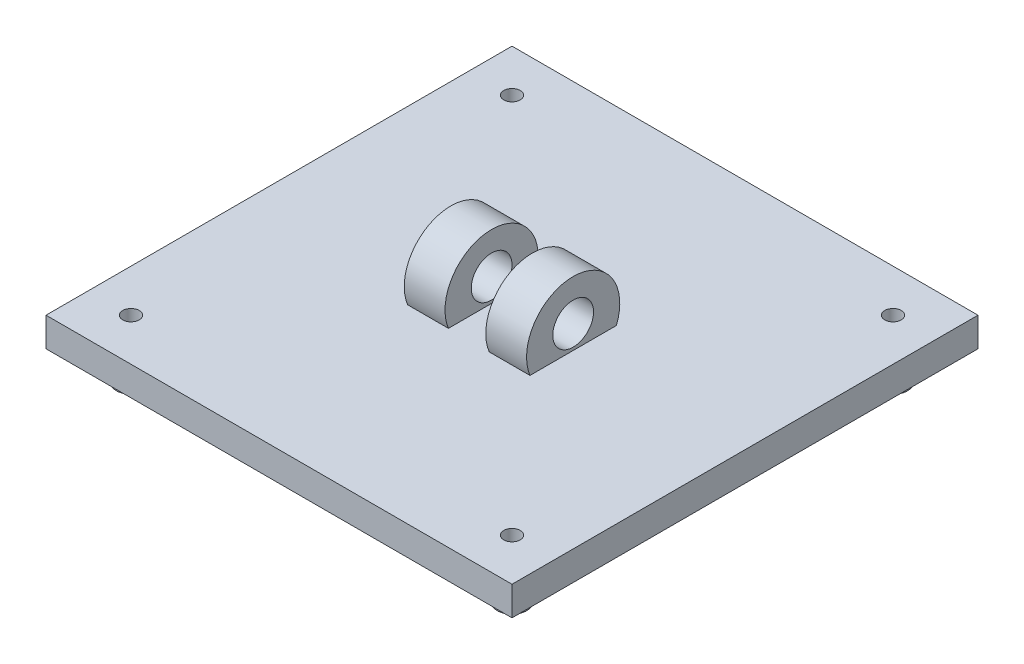
ISO-10303-21;
HEADER;
FILE_DESCRIPTION(('STEP AP214'),'2;1');
FILE_NAME('part.step','',(''),(''),'','','');
FILE_SCHEMA(('AUTOMOTIVE_DESIGN { 1 0 10303 214 1 1 1 1 }'));
ENDSEC;
DATA;
#1=APPLICATION_CONTEXT('core data for automotive mechanical design processes');
#2=APPLICATION_PROTOCOL_DEFINITION('international standard','automotive_design',2000,#1);
#3=PRODUCT_CONTEXT('',#1,'mechanical');
#4=PRODUCT('Part','Part','',(#3));
#5=PRODUCT_RELATED_PRODUCT_CATEGORY('part','',(#4));
#6=PRODUCT_DEFINITION_FORMATION('','',#4);
#7=PRODUCT_DEFINITION_CONTEXT('part definition',#1,'design');
#8=PRODUCT_DEFINITION('design','',#6,#7);
#9=PRODUCT_DEFINITION_SHAPE('','',#8);
#10=(LENGTH_UNIT() NAMED_UNIT(*) SI_UNIT(.MILLI.,.METRE.));
#11=(NAMED_UNIT(*) PLANE_ANGLE_UNIT() SI_UNIT($,.RADIAN.));
#12=(NAMED_UNIT(*) SI_UNIT($,.STERADIAN.) SOLID_ANGLE_UNIT());
#13=UNCERTAINTY_MEASURE_WITH_UNIT(LENGTH_MEASURE(1.E-05),#10,'distance_accuracy_value','');
#14=(GEOMETRIC_REPRESENTATION_CONTEXT(3) GLOBAL_UNCERTAINTY_ASSIGNED_CONTEXT((#13)) GLOBAL_UNIT_ASSIGNED_CONTEXT((#10,
#11,#12)) REPRESENTATION_CONTEXT('',''));
#15=CARTESIAN_POINT('',(0.,0.,0.));
#16=DIRECTION('',(0.,0.,1.));
#17=DIRECTION('',(1.,0.,0.));
#18=AXIS2_PLACEMENT_3D('',#15,#16,#17);
#19=CARTESIAN_POINT('',(10.5,8.,0.));
#20=DIRECTION('',(-1.,0.,0.));
#21=DIRECTION('',(0.,0.,1.));
#22=AXIS2_PLACEMENT_3D('',#19,#20,#21);
#23=CYLINDRICAL_SURFACE('',#22,8.);
#24=CARTESIAN_POINT('',(-3.5,8.,0.));
#25=DIRECTION('',(1.,0.,0.));
#26=DIRECTION('',(0.,0.,-1.));
#27=AXIS2_PLACEMENT_3D('',#24,#25,#26);
#28=CIRCLE('',#27,8.);
#29=CARTESIAN_POINT('',(-3.5,5.,-7.41619848709566));
#30=VERTEX_POINT('',#29);
#31=CARTESIAN_POINT('',(-3.5,5.,7.41619848709566));
#32=VERTEX_POINT('',#31);
#33=EDGE_CURVE('E117',#30,#32,#28,.T.);
#34=ORIENTED_EDGE('',*,*,#33,.F.);
#35=DIRECTION('',(-1.,0.,0.));
#36=VECTOR('',#35,1.);
#37=CARTESIAN_POINT('',(10.5,5.,-7.41619848709566));
#38=LINE('',#37,#36);
#39=CARTESIAN_POINT('',(-10.5,5.,-7.41619848709566));
#40=VERTEX_POINT('',#39);
#41=EDGE_CURVE('E126',#30,#40,#38,.T.);
#42=ORIENTED_EDGE('',*,*,#41,.T.);
#43=CARTESIAN_POINT('',(-10.5,8.,0.));
#44=DIRECTION('',(1.,0.,0.));
#45=DIRECTION('',(0.,0.,-1.));
#46=AXIS2_PLACEMENT_3D('',#43,#44,#45);
#47=CIRCLE('',#46,8.);
#48=CARTESIAN_POINT('',(-10.5,5.,7.41619848709566));
#49=VERTEX_POINT('',#48);
#50=EDGE_CURVE('E130',#40,#49,#47,.T.);
#51=ORIENTED_EDGE('',*,*,#50,.T.);
#52=DIRECTION('',(-1.,0.,0.));
#53=VECTOR('',#52,1.);
#54=CARTESIAN_POINT('',(10.5,5.,7.41619848709566));
#55=LINE('',#54,#53);
#56=EDGE_CURVE('E128',#49,#32,#55,.F.);
#57=ORIENTED_EDGE('',*,*,#56,.T.);
#58=EDGE_LOOP('',(#34,#42,#51,#57));
#59=FACE_BOUND('',#58,.T.);
#60=ADVANCED_FACE('F47',(#59),#23,.T.);
#61=CARTESIAN_POINT('',(40.,5.,40.));
#62=DIRECTION('',(-1.,0.,0.));
#63=DIRECTION('',(0.,0.,1.));
#64=AXIS2_PLACEMENT_3D('',#61,#62,#63);
#65=PLANE('',#64);
#66=DIRECTION('',(0.,0.,-1.));
#67=VECTOR('',#66,1.);
#68=CARTESIAN_POINT('',(40.,0.,40.));
#69=LINE('',#68,#67);
#70=CARTESIAN_POINT('',(40.,0.,40.));
#71=VERTEX_POINT('',#70);
#72=CARTESIAN_POINT('',(40.,0.,-40.));
#73=VERTEX_POINT('',#72);
#74=EDGE_CURVE('E149',#71,#73,#69,.T.);
#75=ORIENTED_EDGE('',*,*,#74,.T.);
#76=DIRECTION('',(0.,-1.,0.));
#77=VECTOR('',#76,1.);
#78=CARTESIAN_POINT('',(40.,5.,-40.));
#79=LINE('',#78,#77);
#80=CARTESIAN_POINT('',(40.,5.,-40.));
#81=VERTEX_POINT('',#80);
#82=EDGE_CURVE('E11',#81,#73,#79,.T.);
#83=ORIENTED_EDGE('',*,*,#82,.F.);
#84=DIRECTION('',(0.,0.,-1.));
#85=VECTOR('',#84,1.);
#86=CARTESIAN_POINT('',(40.,5.,40.));
#87=LINE('',#86,#85);
#88=CARTESIAN_POINT('',(40.,5.,40.));
#89=VERTEX_POINT('',#88);
#90=EDGE_CURVE('E150',#89,#81,#87,.T.);
#91=ORIENTED_EDGE('',*,*,#90,.F.);
#92=DIRECTION('',(0.,-1.,0.));
#93=VECTOR('',#92,1.);
#94=CARTESIAN_POINT('',(40.,5.,40.));
#95=LINE('',#94,#93);
#96=EDGE_CURVE('E164',#89,#71,#95,.T.);
#97=ORIENTED_EDGE('',*,*,#96,.T.);
#98=EDGE_LOOP('',(#75,#83,#91,#97));
#99=FACE_BOUND('',#98,.T.);
#100=ADVANCED_FACE('F49',(#99),#65,.F.);
#101=CARTESIAN_POINT('',(-40.,5.,-40.));
#102=DIRECTION('',(0.,0.,1.));
#103=DIRECTION('',(1.,0.,0.));
#104=AXIS2_PLACEMENT_3D('',#101,#102,#103);
#105=PLANE('',#104);
#106=DIRECTION('',(-1.,0.,0.));
#107=VECTOR('',#106,1.);
#108=CARTESIAN_POINT('',(-40.,0.,-40.));
#109=LINE('',#108,#107);
#110=CARTESIAN_POINT('',(-40.,0.,-40.));
#111=VERTEX_POINT('',#110);
#112=EDGE_CURVE('E168',#73,#111,#109,.T.);
#113=ORIENTED_EDGE('',*,*,#112,.T.);
#114=DIRECTION('',(0.,-1.,0.));
#115=VECTOR('',#114,1.);
#116=CARTESIAN_POINT('',(-40.,5.,-40.));
#117=LINE('',#116,#115);
#118=CARTESIAN_POINT('',(-40.,5.,-40.));
#119=VERTEX_POINT('',#118);
#120=EDGE_CURVE('E57',#119,#111,#117,.T.);
#121=ORIENTED_EDGE('',*,*,#120,.F.);
#122=DIRECTION('',(-1.,0.,0.));
#123=VECTOR('',#122,1.);
#124=CARTESIAN_POINT('',(-40.,5.,-40.));
#125=LINE('',#124,#123);
#126=EDGE_CURVE('E154',#81,#119,#125,.T.);
#127=ORIENTED_EDGE('',*,*,#126,.F.);
#128=ORIENTED_EDGE('',*,*,#82,.T.);
#129=EDGE_LOOP('',(#113,#121,#127,#128));
#130=FACE_BOUND('',#129,.T.);
#131=ADVANCED_FACE('F203',(#130),#105,.F.);
#132=CARTESIAN_POINT('',(-40.,5.,40.));
#133=DIRECTION('',(1.,0.,0.));
#134=DIRECTION('',(0.,0.,-1.));
#135=AXIS2_PLACEMENT_3D('',#132,#133,#134);
#136=PLANE('',#135);
#137=DIRECTION('',(0.,0.,1.));
#138=VECTOR('',#137,1.);
#139=CARTESIAN_POINT('',(-40.,0.,40.));
#140=LINE('',#139,#138);
#141=CARTESIAN_POINT('',(-40.,0.,40.));
#142=VERTEX_POINT('',#141);
#143=EDGE_CURVE('E171',#111,#142,#140,.T.);
#144=ORIENTED_EDGE('',*,*,#143,.T.);
#145=DIRECTION('',(0.,-1.,0.));
#146=VECTOR('',#145,1.);
#147=CARTESIAN_POINT('',(-40.,5.,40.));
#148=LINE('',#147,#146);
#149=CARTESIAN_POINT('',(-40.,5.,40.));
#150=VERTEX_POINT('',#149);
#151=EDGE_CURVE('E179',#150,#142,#148,.T.);
#152=ORIENTED_EDGE('',*,*,#151,.F.);
#153=DIRECTION('',(0.,0.,1.));
#154=VECTOR('',#153,1.);
#155=CARTESIAN_POINT('',(-40.,5.,40.));
#156=LINE('',#155,#154);
#157=EDGE_CURVE('E158',#119,#150,#156,.T.);
#158=ORIENTED_EDGE('',*,*,#157,.F.);
#159=ORIENTED_EDGE('',*,*,#120,.T.);
#160=EDGE_LOOP('',(#144,#152,#158,#159));
#161=FACE_BOUND('',#160,.T.);
#162=ADVANCED_FACE('F189',(#161),#136,.F.);
#163=CARTESIAN_POINT('',(-40.,5.,40.));
#164=DIRECTION('',(0.,0.,-1.));
#165=DIRECTION('',(-1.,0.,0.));
#166=AXIS2_PLACEMENT_3D('',#163,#164,#165);
#167=PLANE('',#166);
#168=DIRECTION('',(1.,0.,0.));
#169=VECTOR('',#168,1.);
#170=CARTESIAN_POINT('',(-40.,0.,40.));
#171=LINE('',#170,#169);
#172=EDGE_CURVE('E155',#142,#71,#171,.T.);
#173=ORIENTED_EDGE('',*,*,#172,.T.);
#174=ORIENTED_EDGE('',*,*,#96,.F.);
#175=DIRECTION('',(1.,0.,0.));
#176=VECTOR('',#175,1.);
#177=CARTESIAN_POINT('',(-40.,5.,40.));
#178=LINE('',#177,#176);
#179=EDGE_CURVE('E161',#150,#89,#178,.T.);
#180=ORIENTED_EDGE('',*,*,#179,.F.);
#181=ORIENTED_EDGE('',*,*,#151,.T.);
#182=EDGE_LOOP('',(#173,#174,#180,#181));
#183=FACE_BOUND('',#182,.T.);
#184=ADVANCED_FACE('F198',(#183),#167,.F.);
#185=CARTESIAN_POINT('',(0.,5.,0.));
#186=DIRECTION('',(0.,-1.,0.));
#187=DIRECTION('',(0.,0.,-1.));
#188=AXIS2_PLACEMENT_3D('',#185,#186,#187);
#189=PLANE('',#188);
#190=CARTESIAN_POINT('',(32.705,5.,-32.705));
#191=DIRECTION('',(0.,-1.,0.));
#192=DIRECTION('',(0.,0.,-1.));
#193=AXIS2_PLACEMENT_3D('',#190,#191,#192);
#194=CIRCLE('',#193,1.41);
#195=CARTESIAN_POINT('',(32.705,5.,-34.115));
#196=VERTEX_POINT('',#195);
#197=EDGE_CURVE('E296',#196,#196,#194,.T.);
#198=ORIENTED_EDGE('',*,*,#197,.T.);
#199=EDGE_LOOP('',(#198));
#200=FACE_BOUND('',#199,.T.);
#201=CARTESIAN_POINT('',(32.705,5.,32.705));
#202=DIRECTION('',(0.,-1.,0.));
#203=DIRECTION('',(0.,0.,-1.));
#204=AXIS2_PLACEMENT_3D('',#201,#202,#203);
#205=CIRCLE('',#204,1.41);
#206=CARTESIAN_POINT('',(32.705,5.,31.295));
#207=VERTEX_POINT('',#206);
#208=EDGE_CURVE('E292',#207,#207,#205,.T.);
#209=ORIENTED_EDGE('',*,*,#208,.T.);
#210=EDGE_LOOP('',(#209));
#211=FACE_BOUND('',#210,.T.);
#212=CARTESIAN_POINT('',(-32.705,5.,32.705));
#213=DIRECTION('',(0.,-1.,0.));
#214=DIRECTION('',(0.,0.,-1.));
#215=AXIS2_PLACEMENT_3D('',#212,#213,#214);
#216=CIRCLE('',#215,1.41);
#217=CARTESIAN_POINT('',(-32.705,5.,31.295));
#218=VERTEX_POINT('',#217);
#219=EDGE_CURVE('E270',#218,#218,#216,.T.);
#220=ORIENTED_EDGE('',*,*,#219,.T.);
#221=EDGE_LOOP('',(#220));
#222=FACE_BOUND('',#221,.T.);
#223=CARTESIAN_POINT('',(-32.705,5.,-32.705));
#224=DIRECTION('',(0.,-1.,0.));
#225=DIRECTION('',(0.,0.,-1.));
#226=AXIS2_PLACEMENT_3D('',#223,#224,#225);
#227=CIRCLE('',#226,1.41);
#228=CARTESIAN_POINT('',(-32.705,5.,-34.115));
#229=VERTEX_POINT('',#228);
#230=EDGE_CURVE('E300',#229,#229,#227,.T.);
#231=ORIENTED_EDGE('',*,*,#230,.T.);
#232=EDGE_LOOP('',(#231));
#233=FACE_BOUND('',#232,.T.);
#234=CARTESIAN_POINT('',(3.5,5.,7.41619848709566));
#235=VERTEX_POINT('',#234);
#236=CARTESIAN_POINT('',(10.5,5.,7.41619848709566));
#237=VERTEX_POINT('',#236);
#238=EDGE_CURVE('E70',#235,#237,#55,.F.);
#239=ORIENTED_EDGE('',*,*,#238,.F.);
#240=DIRECTION('',(0.,0.,-1.));
#241=VECTOR('',#240,1.);
#242=CARTESIAN_POINT('',(3.5,5.,0.));
#243=LINE('',#242,#241);
#244=CARTESIAN_POINT('',(3.5,5.,-7.41619848709566));
#245=VERTEX_POINT('',#244);
#246=EDGE_CURVE('E63',#235,#245,#243,.T.);
#247=ORIENTED_EDGE('',*,*,#246,.T.);
#248=CARTESIAN_POINT('',(10.5,5.,-7.41619848709566));
#249=VERTEX_POINT('',#248);
#250=EDGE_CURVE('E138',#249,#245,#38,.T.);
#251=ORIENTED_EDGE('',*,*,#250,.F.);
#252=DIRECTION('',(0.,0.,1.));
#253=VECTOR('',#252,1.);
#254=CARTESIAN_POINT('',(10.5,5.,0.));
#255=LINE('',#254,#253);
#256=EDGE_CURVE('E139',#249,#237,#255,.T.);
#257=ORIENTED_EDGE('',*,*,#256,.T.);
#258=EDGE_LOOP('',(#239,#247,#251,#257));
#259=FACE_BOUND('',#258,.T.);
#260=DIRECTION('',(0.,0.,-1.));
#261=VECTOR('',#260,1.);
#262=CARTESIAN_POINT('',(-3.5,5.,0.));
#263=LINE('',#262,#261);
#264=EDGE_CURVE('E114',#32,#30,#263,.T.);
#265=ORIENTED_EDGE('',*,*,#264,.F.);
#266=ORIENTED_EDGE('',*,*,#56,.F.);
#267=DIRECTION('',(0.,0.,1.));
#268=VECTOR('',#267,1.);
#269=CARTESIAN_POINT('',(-10.5,5.,0.));
#270=LINE('',#269,#268);
#271=EDGE_CURVE('E135',#40,#49,#270,.T.);
#272=ORIENTED_EDGE('',*,*,#271,.F.);
#273=ORIENTED_EDGE('',*,*,#41,.F.);
#274=EDGE_LOOP('',(#265,#266,#272,#273));
#275=FACE_BOUND('',#274,.T.);
#276=ORIENTED_EDGE('',*,*,#90,.T.);
#277=ORIENTED_EDGE('',*,*,#126,.T.);
#278=ORIENTED_EDGE('',*,*,#157,.T.);
#279=ORIENTED_EDGE('',*,*,#179,.T.);
#280=EDGE_LOOP('',(#276,#277,#278,#279));
#281=FACE_BOUND('',#280,.T.);
#282=ADVANCED_FACE('F132',(#200,#211,#222,#233,#259,#275,#281),#189,.F.);
#283=CARTESIAN_POINT('',(0.,0.,0.));
#284=DIRECTION('',(0.,-1.,0.));
#285=DIRECTION('',(0.,0.,-1.));
#286=AXIS2_PLACEMENT_3D('',#283,#284,#285);
#287=PLANE('',#286);
#288=CARTESIAN_POINT('',(-32.705,0.,-32.705));
#289=DIRECTION('',(0.,-1.,0.));
#290=DIRECTION('',(0.,0.,-1.));
#291=AXIS2_PLACEMENT_3D('',#288,#289,#290);
#292=CIRCLE('',#291,2.5);
#293=CARTESIAN_POINT('',(-32.705,0.,-35.205));
#294=VERTEX_POINT('',#293);
#295=EDGE_CURVE('E269',#294,#294,#292,.T.);
#296=ORIENTED_EDGE('',*,*,#295,.F.);
#297=EDGE_LOOP('',(#296));
#298=FACE_BOUND('',#297,.T.);
#299=CARTESIAN_POINT('',(32.705,0.,-32.705));
#300=DIRECTION('',(0.,-1.,0.));
#301=DIRECTION('',(0.,0.,-1.));
#302=AXIS2_PLACEMENT_3D('',#299,#300,#301);
#303=CIRCLE('',#302,2.5);
#304=CARTESIAN_POINT('',(32.705,0.,-35.205));
#305=VERTEX_POINT('',#304);
#306=EDGE_CURVE('E278',#305,#305,#303,.T.);
#307=ORIENTED_EDGE('',*,*,#306,.F.);
#308=EDGE_LOOP('',(#307));
#309=FACE_BOUND('',#308,.T.);
#310=CARTESIAN_POINT('',(32.705,0.,32.705));
#311=DIRECTION('',(0.,-1.,0.));
#312=DIRECTION('',(0.,0.,-1.));
#313=AXIS2_PLACEMENT_3D('',#310,#311,#312);
#314=CIRCLE('',#313,2.5);
#315=CARTESIAN_POINT('',(32.705,0.,30.205));
#316=VERTEX_POINT('',#315);
#317=EDGE_CURVE('E261',#316,#316,#314,.T.);
#318=ORIENTED_EDGE('',*,*,#317,.F.);
#319=EDGE_LOOP('',(#318));
#320=FACE_BOUND('',#319,.T.);
#321=CARTESIAN_POINT('',(-32.705,0.,32.705));
#322=DIRECTION('',(0.,-1.,0.));
#323=DIRECTION('',(0.,0.,-1.));
#324=AXIS2_PLACEMENT_3D('',#321,#322,#323);
#325=CIRCLE('',#324,2.5);
#326=CARTESIAN_POINT('',(-32.705,0.,30.205));
#327=VERTEX_POINT('',#326);
#328=EDGE_CURVE('E257',#327,#327,#325,.T.);
#329=ORIENTED_EDGE('',*,*,#328,.F.);
#330=EDGE_LOOP('',(#329));
#331=FACE_BOUND('',#330,.T.);
#332=ORIENTED_EDGE('',*,*,#74,.F.);
#333=ORIENTED_EDGE('',*,*,#172,.F.);
#334=ORIENTED_EDGE('',*,*,#143,.F.);
#335=ORIENTED_EDGE('',*,*,#112,.F.);
#336=EDGE_LOOP('',(#332,#333,#334,#335));
#337=FACE_BOUND('',#336,.T.);
#338=ADVANCED_FACE('F195',(#298,#309,#320,#331,#337),#287,.T.);
#339=ORIENTED_EDGE('',*,*,#250,.T.);
#340=CARTESIAN_POINT('',(3.5,8.,0.));
#341=DIRECTION('',(1.,0.,0.));
#342=DIRECTION('',(0.,0.,-1.));
#343=AXIS2_PLACEMENT_3D('',#340,#341,#342);
#344=CIRCLE('',#343,8.);
#345=EDGE_CURVE('E122',#245,#235,#344,.T.);
#346=ORIENTED_EDGE('',*,*,#345,.T.);
#347=ORIENTED_EDGE('',*,*,#238,.T.);
#348=CARTESIAN_POINT('',(10.5,8.,0.));
#349=DIRECTION('',(1.,0.,0.));
#350=DIRECTION('',(0.,0.,-1.));
#351=AXIS2_PLACEMENT_3D('',#348,#349,#350);
#352=CIRCLE('',#351,8.);
#353=EDGE_CURVE('E230',#249,#237,#352,.T.);
#354=ORIENTED_EDGE('',*,*,#353,.F.);
#355=EDGE_LOOP('',(#339,#346,#347,#354));
#356=FACE_BOUND('',#355,.T.);
#357=ADVANCED_FACE('F212',(#356),#23,.T.);
#358=CARTESIAN_POINT('',(10.5,0.,0.));
#359=DIRECTION('',(1.,0.,0.));
#360=DIRECTION('',(0.,0.,-1.));
#361=AXIS2_PLACEMENT_3D('',#358,#359,#360);
#362=PLANE('',#361);
#363=CARTESIAN_POINT('',(10.5,9.,0.));
#364=DIRECTION('',(1.,0.,0.));
#365=DIRECTION('',(0.,0.,-1.));
#366=AXIS2_PLACEMENT_3D('',#363,#364,#365);
#367=CIRCLE('',#366,3.5);
#368=CARTESIAN_POINT('',(10.5,9.,-3.5));
#369=VERTEX_POINT('',#368);
#370=EDGE_CURVE('E252',#369,#369,#367,.T.);
#371=ORIENTED_EDGE('',*,*,#370,.F.);
#372=EDGE_LOOP('',(#371));
#373=FACE_BOUND('',#372,.T.);
#374=ORIENTED_EDGE('',*,*,#256,.F.);
#375=ORIENTED_EDGE('',*,*,#353,.T.);
#376=EDGE_LOOP('',(#374,#375));
#377=FACE_BOUND('',#376,.T.);
#378=ADVANCED_FACE('F219',(#373,#377),#362,.T.);
#379=CARTESIAN_POINT('',(-10.5,0.,0.));
#380=DIRECTION('',(1.,0.,0.));
#381=DIRECTION('',(0.,0.,-1.));
#382=AXIS2_PLACEMENT_3D('',#379,#380,#381);
#383=PLANE('',#382);
#384=CARTESIAN_POINT('',(-10.5,9.,0.));
#385=DIRECTION('',(1.,0.,0.));
#386=DIRECTION('',(0.,0.,-1.));
#387=AXIS2_PLACEMENT_3D('',#384,#385,#386);
#388=CIRCLE('',#387,3.5);
#389=CARTESIAN_POINT('',(-10.5,9.,-3.5));
#390=VERTEX_POINT('',#389);
#391=EDGE_CURVE('E243',#390,#390,#388,.T.);
#392=ORIENTED_EDGE('',*,*,#391,.T.);
#393=EDGE_LOOP('',(#392));
#394=FACE_BOUND('',#393,.T.);
#395=ORIENTED_EDGE('',*,*,#50,.F.);
#396=ORIENTED_EDGE('',*,*,#271,.T.);
#397=EDGE_LOOP('',(#395,#396));
#398=FACE_BOUND('',#397,.T.);
#399=ADVANCED_FACE('F223',(#394,#398),#383,.F.);
#400=CARTESIAN_POINT('',(-3.5,0.,0.));
#401=DIRECTION('',(1.,0.,0.));
#402=DIRECTION('',(0.,0.,-1.));
#403=AXIS2_PLACEMENT_3D('',#400,#401,#402);
#404=PLANE('',#403);
#405=CARTESIAN_POINT('',(-3.5,9.,0.));
#406=DIRECTION('',(1.,0.,0.));
#407=DIRECTION('',(0.,0.,-1.));
#408=AXIS2_PLACEMENT_3D('',#405,#406,#407);
#409=CIRCLE('',#408,3.5);
#410=CARTESIAN_POINT('',(-3.5,9.,-3.5));
#411=VERTEX_POINT('',#410);
#412=EDGE_CURVE('E248',#411,#411,#409,.T.);
#413=ORIENTED_EDGE('',*,*,#412,.F.);
#414=EDGE_LOOP('',(#413));
#415=FACE_BOUND('',#414,.T.);
#416=ORIENTED_EDGE('',*,*,#264,.T.);
#417=ORIENTED_EDGE('',*,*,#33,.T.);
#418=EDGE_LOOP('',(#416,#417));
#419=FACE_BOUND('',#418,.T.);
#420=ADVANCED_FACE('F116',(#415,#419),#404,.T.);
#421=CARTESIAN_POINT('',(3.5,0.,0.));
#422=DIRECTION('',(1.,0.,0.));
#423=DIRECTION('',(0.,0.,-1.));
#424=AXIS2_PLACEMENT_3D('',#421,#422,#423);
#425=PLANE('',#424);
#426=CARTESIAN_POINT('',(3.5,9.,0.));
#427=DIRECTION('',(1.,0.,0.));
#428=DIRECTION('',(0.,0.,-1.));
#429=AXIS2_PLACEMENT_3D('',#426,#427,#428);
#430=CIRCLE('',#429,3.5);
#431=CARTESIAN_POINT('',(3.5,9.,-3.5));
#432=VERTEX_POINT('',#431);
#433=EDGE_CURVE('E51',#432,#432,#430,.T.);
#434=ORIENTED_EDGE('',*,*,#433,.T.);
#435=EDGE_LOOP('',(#434));
#436=FACE_BOUND('',#435,.T.);
#437=ORIENTED_EDGE('',*,*,#246,.F.);
#438=ORIENTED_EDGE('',*,*,#345,.F.);
#439=EDGE_LOOP('',(#437,#438));
#440=FACE_BOUND('',#439,.T.);
#441=ADVANCED_FACE('F349',(#436,#440),#425,.F.);
#442=CARTESIAN_POINT('',(-40.,9.,0.));
#443=DIRECTION('',(1.,0.,0.));
#444=DIRECTION('',(0.,0.,-1.));
#445=AXIS2_PLACEMENT_3D('',#442,#443,#444);
#446=CYLINDRICAL_SURFACE('',#445,3.5);
#447=ORIENTED_EDGE('',*,*,#370,.T.);
#448=EDGE_LOOP('',(#447));
#449=FACE_BOUND('',#448,.T.);
#450=ORIENTED_EDGE('',*,*,#433,.F.);
#451=EDGE_LOOP('',(#450));
#452=FACE_BOUND('',#451,.T.);
#453=ADVANCED_FACE('F342',(#449,#452),#446,.F.);
#454=ORIENTED_EDGE('',*,*,#412,.T.);
#455=EDGE_LOOP('',(#454));
#456=FACE_BOUND('',#455,.T.);
#457=ORIENTED_EDGE('',*,*,#391,.F.);
#458=EDGE_LOOP('',(#457));
#459=FACE_BOUND('',#458,.T.);
#460=ADVANCED_FACE('F334',(#456,#459),#446,.F.);
#461=CARTESIAN_POINT('',(-32.705,-5.,32.705));
#462=DIRECTION('',(0.,1.,0.));
#463=DIRECTION('',(0.,0.,1.));
#464=AXIS2_PLACEMENT_3D('',#461,#462,#463);
#465=CYLINDRICAL_SURFACE('',#464,2.5);
#466=CARTESIAN_POINT('',(-32.705,-5.,32.705));
#467=DIRECTION('',(0.,-1.,0.));
#468=DIRECTION('',(0.,0.,-1.));
#469=AXIS2_PLACEMENT_3D('',#466,#467,#468);
#470=CIRCLE('',#469,2.5);
#471=CARTESIAN_POINT('',(-32.705,-5.,30.205));
#472=VERTEX_POINT('',#471);
#473=EDGE_CURVE('E256',#472,#472,#470,.T.);
#474=ORIENTED_EDGE('',*,*,#473,.F.);
#475=EDGE_LOOP('',(#474));
#476=FACE_BOUND('',#475,.T.);
#477=ORIENTED_EDGE('',*,*,#328,.T.);
#478=EDGE_LOOP('',(#477));
#479=FACE_BOUND('',#478,.T.);
#480=ADVANCED_FACE('F328',(#476,#479),#465,.T.);
#481=CARTESIAN_POINT('',(-32.705,-5.,32.705));
#482=DIRECTION('',(0.,-1.,0.));
#483=DIRECTION('',(0.,0.,-1.));
#484=AXIS2_PLACEMENT_3D('',#481,#482,#483);
#485=PLANE('',#484);
#486=CARTESIAN_POINT('',(-32.705,-5.,32.705));
#487=DIRECTION('',(0.,-1.,0.));
#488=DIRECTION('',(0.,0.,-1.));
#489=AXIS2_PLACEMENT_3D('',#486,#487,#488);
#490=CIRCLE('',#489,1.41);
#491=CARTESIAN_POINT('',(-32.705,-5.,31.295));
#492=VERTEX_POINT('',#491);
#493=EDGE_CURVE('E308',#492,#492,#490,.T.);
#494=ORIENTED_EDGE('',*,*,#493,.F.);
#495=EDGE_LOOP('',(#494));
#496=FACE_BOUND('',#495,.T.);
#497=ORIENTED_EDGE('',*,*,#473,.T.);
#498=EDGE_LOOP('',(#497));
#499=FACE_BOUND('',#498,.T.);
#500=ADVANCED_FACE('F324',(#496,#499),#485,.T.);
#501=CARTESIAN_POINT('',(32.705,-5.,32.705));
#502=DIRECTION('',(0.,1.,0.));
#503=DIRECTION('',(0.,0.,1.));
#504=AXIS2_PLACEMENT_3D('',#501,#502,#503);
#505=CYLINDRICAL_SURFACE('',#504,2.5);
#506=CARTESIAN_POINT('',(32.705,-5.,32.705));
#507=DIRECTION('',(0.,-1.,0.));
#508=DIRECTION('',(0.,0.,-1.));
#509=AXIS2_PLACEMENT_3D('',#506,#507,#508);
#510=CIRCLE('',#509,2.5);
#511=CARTESIAN_POINT('',(32.705,-5.,30.205));
#512=VERTEX_POINT('',#511);
#513=EDGE_CURVE('E282',#512,#512,#510,.T.);
#514=ORIENTED_EDGE('',*,*,#513,.F.);
#515=EDGE_LOOP('',(#514));
#516=FACE_BOUND('',#515,.T.);
#517=ORIENTED_EDGE('',*,*,#317,.T.);
#518=EDGE_LOOP('',(#517));
#519=FACE_BOUND('',#518,.T.);
#520=ADVANCED_FACE('F327',(#516,#519),#505,.T.);
#521=CARTESIAN_POINT('',(32.705,-5.,32.705));
#522=DIRECTION('',(0.,-1.,0.));
#523=DIRECTION('',(0.,0.,-1.));
#524=AXIS2_PLACEMENT_3D('',#521,#522,#523);
#525=PLANE('',#524);
#526=CARTESIAN_POINT('',(32.705,-5.,32.705));
#527=DIRECTION('',(0.,-1.,0.));
#528=DIRECTION('',(0.,0.,-1.));
#529=AXIS2_PLACEMENT_3D('',#526,#527,#528);
#530=CIRCLE('',#529,1.41);
#531=CARTESIAN_POINT('',(32.705,-5.,31.295));
#532=VERTEX_POINT('',#531);
#533=EDGE_CURVE('E313',#532,#532,#530,.T.);
#534=ORIENTED_EDGE('',*,*,#533,.F.);
#535=EDGE_LOOP('',(#534));
#536=FACE_BOUND('',#535,.T.);
#537=ORIENTED_EDGE('',*,*,#513,.T.);
#538=EDGE_LOOP('',(#537));
#539=FACE_BOUND('',#538,.T.);
#540=ADVANCED_FACE('F429',(#536,#539),#525,.T.);
#541=CARTESIAN_POINT('',(32.705,-5.,-32.705));
#542=DIRECTION('',(0.,1.,0.));
#543=DIRECTION('',(0.,0.,1.));
#544=AXIS2_PLACEMENT_3D('',#541,#542,#543);
#545=CYLINDRICAL_SURFACE('',#544,2.5);
#546=CARTESIAN_POINT('',(32.705,-5.,-32.705));
#547=DIRECTION('',(0.,-1.,0.));
#548=DIRECTION('',(0.,0.,-1.));
#549=AXIS2_PLACEMENT_3D('',#546,#547,#548);
#550=CIRCLE('',#549,2.5);
#551=CARTESIAN_POINT('',(32.705,-5.,-35.205));
#552=VERTEX_POINT('',#551);
#553=EDGE_CURVE('E274',#552,#552,#550,.T.);
#554=ORIENTED_EDGE('',*,*,#553,.F.);
#555=EDGE_LOOP('',(#554));
#556=FACE_BOUND('',#555,.T.);
#557=ORIENTED_EDGE('',*,*,#306,.T.);
#558=EDGE_LOOP('',(#557));
#559=FACE_BOUND('',#558,.T.);
#560=ADVANCED_FACE('F438',(#556,#559),#545,.T.);
#561=CARTESIAN_POINT('',(32.705,-5.,-32.705));
#562=DIRECTION('',(0.,-1.,0.));
#563=DIRECTION('',(0.,0.,-1.));
#564=AXIS2_PLACEMENT_3D('',#561,#562,#563);
#565=PLANE('',#564);
#566=CARTESIAN_POINT('',(32.705,-5.,-32.705));
#567=DIRECTION('',(0.,-1.,0.));
#568=DIRECTION('',(0.,0.,-1.));
#569=AXIS2_PLACEMENT_3D('',#566,#567,#568);
#570=CIRCLE('',#569,1.41);
#571=CARTESIAN_POINT('',(32.705,-5.,-34.115));
#572=VERTEX_POINT('',#571);
#573=EDGE_CURVE('E309',#572,#572,#570,.T.);
#574=ORIENTED_EDGE('',*,*,#573,.F.);
#575=EDGE_LOOP('',(#574));
#576=FACE_BOUND('',#575,.T.);
#577=ORIENTED_EDGE('',*,*,#553,.T.);
#578=EDGE_LOOP('',(#577));
#579=FACE_BOUND('',#578,.T.);
#580=ADVANCED_FACE('F447',(#576,#579),#565,.T.);
#581=CARTESIAN_POINT('',(-32.705,-5.,-32.705));
#582=DIRECTION('',(0.,1.,0.));
#583=DIRECTION('',(0.,0.,1.));
#584=AXIS2_PLACEMENT_3D('',#581,#582,#583);
#585=CYLINDRICAL_SURFACE('',#584,2.5);
#586=CARTESIAN_POINT('',(-32.705,-5.,-32.705));
#587=DIRECTION('',(0.,-1.,0.));
#588=DIRECTION('',(0.,0.,-1.));
#589=AXIS2_PLACEMENT_3D('',#586,#587,#588);
#590=CIRCLE('',#589,2.5);
#591=CARTESIAN_POINT('',(-32.705,-5.,-35.205));
#592=VERTEX_POINT('',#591);
#593=EDGE_CURVE('E265',#592,#592,#590,.T.);
#594=ORIENTED_EDGE('',*,*,#593,.F.);
#595=EDGE_LOOP('',(#594));
#596=FACE_BOUND('',#595,.T.);
#597=ORIENTED_EDGE('',*,*,#295,.T.);
#598=EDGE_LOOP('',(#597));
#599=FACE_BOUND('',#598,.T.);
#600=ADVANCED_FACE('F456',(#596,#599),#585,.T.);
#601=CARTESIAN_POINT('',(-32.705,-5.,-32.705));
#602=DIRECTION('',(0.,-1.,0.));
#603=DIRECTION('',(0.,0.,-1.));
#604=AXIS2_PLACEMENT_3D('',#601,#602,#603);
#605=PLANE('',#604);
#606=CARTESIAN_POINT('',(-32.705,-5.,-32.705));
#607=DIRECTION('',(0.,-1.,0.));
#608=DIRECTION('',(0.,0.,-1.));
#609=AXIS2_PLACEMENT_3D('',#606,#607,#608);
#610=CIRCLE('',#609,1.41);
#611=CARTESIAN_POINT('',(-32.705,-5.,-34.115));
#612=VERTEX_POINT('',#611);
#613=EDGE_CURVE('E304',#612,#612,#610,.T.);
#614=ORIENTED_EDGE('',*,*,#613,.F.);
#615=EDGE_LOOP('',(#614));
#616=FACE_BOUND('',#615,.T.);
#617=ORIENTED_EDGE('',*,*,#593,.T.);
#618=EDGE_LOOP('',(#617));
#619=FACE_BOUND('',#618,.T.);
#620=ADVANCED_FACE('F465',(#616,#619),#605,.T.);
#621=CARTESIAN_POINT('',(-32.705,16.,-32.705));
#622=DIRECTION('',(0.,-1.,0.));
#623=DIRECTION('',(0.,0.,-1.));
#624=AXIS2_PLACEMENT_3D('',#621,#622,#623);
#625=CYLINDRICAL_SURFACE('',#624,1.41);
#626=CARTESIAN_POINT('',(-32.705,-5.,-34.115));
#627=CARTESIAN_POINT('',(-32.705,-4.89583333333333,-34.115));
#628=CARTESIAN_POINT('',(-32.705,-4.79166666666667,-34.115));
#629=CARTESIAN_POINT('',(-32.705,-4.58333333333333,-34.115));
#630=CARTESIAN_POINT('',(-32.705,-4.47916666666667,-34.115));
#631=CARTESIAN_POINT('',(-32.705,-4.27083333333333,-34.115));
#632=CARTESIAN_POINT('',(-32.705,-4.16666666666667,-34.115));
#633=CARTESIAN_POINT('',(-32.705,-3.95833333333333,-34.115));
#634=CARTESIAN_POINT('',(-32.705,-3.85416666666667,-34.115));
#635=CARTESIAN_POINT('',(-32.705,-3.64583333333333,-34.115));
#636=CARTESIAN_POINT('',(-32.705,-3.54166666666667,-34.115));
#637=CARTESIAN_POINT('',(-32.705,-3.33333333333333,-34.115));
#638=CARTESIAN_POINT('',(-32.705,-3.22916666666667,-34.115));
#639=CARTESIAN_POINT('',(-32.705,-3.02083333333333,-34.115));
#640=CARTESIAN_POINT('',(-32.705,-2.91666666666667,-34.115));
#641=CARTESIAN_POINT('',(-32.705,-2.70833333333333,-34.115));
#642=CARTESIAN_POINT('',(-32.705,-2.60416666666667,-34.115));
#643=CARTESIAN_POINT('',(-32.705,-2.39583333333333,-34.115));
#644=CARTESIAN_POINT('',(-32.705,-2.29166666666667,-34.115));
#645=CARTESIAN_POINT('',(-32.705,-2.08333333333333,-34.115));
#646=CARTESIAN_POINT('',(-32.705,-1.97916666666667,-34.115));
#647=CARTESIAN_POINT('',(-32.705,-1.77083333333333,-34.115));
#648=CARTESIAN_POINT('',(-32.705,-1.66666666666666,-34.115));
#649=CARTESIAN_POINT('',(-32.705,-1.45833333333333,-34.115));
#650=CARTESIAN_POINT('',(-32.705,-1.35416666666666,-34.115));
#651=CARTESIAN_POINT('',(-32.705,-1.14583333333333,-34.115));
#652=CARTESIAN_POINT('',(-32.705,-1.04166666666666,-34.115));
#653=CARTESIAN_POINT('',(-32.705,-0.833333333333331,-34.115));
#654=CARTESIAN_POINT('',(-32.705,-0.729166666666664,-34.115));
#655=CARTESIAN_POINT('',(-32.705,-0.52083333333333,-34.115));
#656=CARTESIAN_POINT('',(-32.705,-0.416666666666664,-34.115));
#657=CARTESIAN_POINT('',(-32.705,-0.20833333333333,-34.115));
#658=CARTESIAN_POINT('',(-32.705,-0.104166666666663,-34.115));
#659=CARTESIAN_POINT('',(-32.705,0.10416666666667,-34.115));
#660=CARTESIAN_POINT('',(-32.705,0.208333333333337,-34.115));
#661=CARTESIAN_POINT('',(-32.705,0.416666666666669,-34.115));
#662=CARTESIAN_POINT('',(-32.705,0.520833333333335,-34.115));
#663=CARTESIAN_POINT('',(-32.705,0.729166666666667,-34.115));
#664=CARTESIAN_POINT('',(-32.705,0.833333333333334,-34.115));
#665=CARTESIAN_POINT('',(-32.705,1.04166666666667,-34.115));
#666=CARTESIAN_POINT('',(-32.705,1.14583333333333,-34.115));
#667=CARTESIAN_POINT('',(-32.705,1.35416666666667,-34.115));
#668=CARTESIAN_POINT('',(-32.705,1.45833333333333,-34.115));
#669=CARTESIAN_POINT('',(-32.705,1.66666666666667,-34.115));
#670=CARTESIAN_POINT('',(-32.705,1.77083333333333,-34.115));
#671=CARTESIAN_POINT('',(-32.705,1.97916666666667,-34.115));
#672=CARTESIAN_POINT('',(-32.705,2.08333333333333,-34.115));
#673=CARTESIAN_POINT('',(-32.705,2.29166666666667,-34.115));
#674=CARTESIAN_POINT('',(-32.705,2.39583333333333,-34.115));
#675=CARTESIAN_POINT('',(-32.705,2.60416666666667,-34.115));
#676=CARTESIAN_POINT('',(-32.705,2.70833333333333,-34.115));
#677=CARTESIAN_POINT('',(-32.705,2.91666666666667,-34.115));
#678=CARTESIAN_POINT('',(-32.705,3.02083333333333,-34.115));
#679=CARTESIAN_POINT('',(-32.705,3.22916666666667,-34.115));
#680=CARTESIAN_POINT('',(-32.705,3.33333333333333,-34.115));
#681=CARTESIAN_POINT('',(-32.705,3.54166666666667,-34.115));
#682=CARTESIAN_POINT('',(-32.705,3.64583333333333,-34.115));
#683=CARTESIAN_POINT('',(-32.705,3.85416666666667,-34.115));
#684=CARTESIAN_POINT('',(-32.705,3.95833333333334,-34.115));
#685=CARTESIAN_POINT('',(-32.705,4.16666666666667,-34.115));
#686=CARTESIAN_POINT('',(-32.705,4.27083333333334,-34.115));
#687=CARTESIAN_POINT('',(-32.705,4.47916666666667,-34.115));
#688=CARTESIAN_POINT('',(-32.705,4.58333333333334,-34.115));
#689=CARTESIAN_POINT('',(-32.705,4.79166666666667,-34.115));
#690=CARTESIAN_POINT('',(-32.705,4.89583333333334,-34.115));
#691=CARTESIAN_POINT('',(-32.705,5.,-34.115));
#692=B_SPLINE_CURVE_WITH_KNOTS('',3,(#626,#627,#628,#629,#630,#631,#632,#633,#634,#635,#636,
#637,#638,#639,#640,#641,#642,#643,#644,#645,#646,#647,#648,#649,#650,#651,#652,#653,#654,#655,
#656,#657,#658,#659,#660,#661,#662,#663,#664,#665,#666,#667,#668,#669,#670,#671,#672,#673,#674,
#675,#676,#677,#678,#679,#680,#681,#682,#683,#684,#685,#686,#687,#688,#689,#690,#691),
.UNSPECIFIED.,.F.,.F.,(4,2,2,2,2,2,2,2,2,2,2,2,2,2,2,2,2,2,2,2,2,2,2,2,2,2,2,2,2,2,2,2,4),(0.,
0.3125,0.625000000000001,0.937500000000001,1.25,1.5625,1.875,2.1875,2.5,2.8125,3.125,3.4375,
3.75,4.0625,4.375,4.6875,5.,5.3125,5.625,5.9375,6.25,6.5625,6.875,7.1875,7.5,7.8125,8.125,
8.4375,8.75,9.0625,9.375,9.6875,10.),.UNSPECIFIED.);
#693=EDGE_CURVE('BSEAM474',#612,#229,#692,.T.);
#694=ORIENTED_EDGE('',*,*,#613,.T.);
#695=ORIENTED_EDGE('',*,*,#230,.F.);
#696=ORIENTED_EDGE('',*,*,#693,.T.);
#697=ORIENTED_EDGE('',*,*,#693,.F.);
#698=EDGE_LOOP('',(#694,#696,#695,#697));
#699=FACE_BOUND('',#698,.T.);
#700=ADVANCED_FACE('F474',(#699),#625,.F.);
#701=CARTESIAN_POINT('',(32.705,16.,-32.705));
#702=DIRECTION('',(0.,-1.,0.));
#703=DIRECTION('',(0.,0.,-1.));
#704=AXIS2_PLACEMENT_3D('',#701,#702,#703);
#705=CYLINDRICAL_SURFACE('',#704,1.41);
#706=CARTESIAN_POINT('',(32.705,-5.,-34.115));
#707=CARTESIAN_POINT('',(32.705,-4.89583333333333,-34.115));
#708=CARTESIAN_POINT('',(32.705,-4.79166666666667,-34.115));
#709=CARTESIAN_POINT('',(32.705,-4.58333333333333,-34.115));
#710=CARTESIAN_POINT('',(32.705,-4.47916666666667,-34.115));
#711=CARTESIAN_POINT('',(32.705,-4.27083333333333,-34.115));
#712=CARTESIAN_POINT('',(32.705,-4.16666666666667,-34.115));
#713=CARTESIAN_POINT('',(32.705,-3.95833333333333,-34.115));
#714=CARTESIAN_POINT('',(32.705,-3.85416666666667,-34.115));
#715=CARTESIAN_POINT('',(32.705,-3.64583333333333,-34.115));
#716=CARTESIAN_POINT('',(32.705,-3.54166666666667,-34.115));
#717=CARTESIAN_POINT('',(32.705,-3.33333333333333,-34.115));
#718=CARTESIAN_POINT('',(32.705,-3.22916666666667,-34.115));
#719=CARTESIAN_POINT('',(32.705,-3.02083333333333,-34.115));
#720=CARTESIAN_POINT('',(32.705,-2.91666666666667,-34.115));
#721=CARTESIAN_POINT('',(32.705,-2.70833333333333,-34.115));
#722=CARTESIAN_POINT('',(32.705,-2.60416666666667,-34.115));
#723=CARTESIAN_POINT('',(32.705,-2.39583333333333,-34.115));
#724=CARTESIAN_POINT('',(32.705,-2.29166666666667,-34.115));
#725=CARTESIAN_POINT('',(32.705,-2.08333333333333,-34.115));
#726=CARTESIAN_POINT('',(32.705,-1.97916666666667,-34.115));
#727=CARTESIAN_POINT('',(32.705,-1.77083333333333,-34.115));
#728=CARTESIAN_POINT('',(32.705,-1.66666666666666,-34.115));
#729=CARTESIAN_POINT('',(32.705,-1.45833333333333,-34.115));
#730=CARTESIAN_POINT('',(32.705,-1.35416666666666,-34.115));
#731=CARTESIAN_POINT('',(32.705,-1.14583333333333,-34.115));
#732=CARTESIAN_POINT('',(32.705,-1.04166666666666,-34.115));
#733=CARTESIAN_POINT('',(32.705,-0.833333333333331,-34.115));
#734=CARTESIAN_POINT('',(32.705,-0.729166666666664,-34.115));
#735=CARTESIAN_POINT('',(32.705,-0.52083333333333,-34.115));
#736=CARTESIAN_POINT('',(32.705,-0.416666666666664,-34.115));
#737=CARTESIAN_POINT('',(32.705,-0.20833333333333,-34.115));
#738=CARTESIAN_POINT('',(32.705,-0.104166666666663,-34.115));
#739=CARTESIAN_POINT('',(32.705,0.10416666666667,-34.115));
#740=CARTESIAN_POINT('',(32.705,0.208333333333337,-34.115));
#741=CARTESIAN_POINT('',(32.705,0.416666666666669,-34.115));
#742=CARTESIAN_POINT('',(32.705,0.520833333333335,-34.115));
#743=CARTESIAN_POINT('',(32.705,0.729166666666667,-34.115));
#744=CARTESIAN_POINT('',(32.705,0.833333333333334,-34.115));
#745=CARTESIAN_POINT('',(32.705,1.04166666666667,-34.115));
#746=CARTESIAN_POINT('',(32.705,1.14583333333333,-34.115));
#747=CARTESIAN_POINT('',(32.705,1.35416666666667,-34.115));
#748=CARTESIAN_POINT('',(32.705,1.45833333333333,-34.115));
#749=CARTESIAN_POINT('',(32.705,1.66666666666667,-34.115));
#750=CARTESIAN_POINT('',(32.705,1.77083333333333,-34.115));
#751=CARTESIAN_POINT('',(32.705,1.97916666666667,-34.115));
#752=CARTESIAN_POINT('',(32.705,2.08333333333333,-34.115));
#753=CARTESIAN_POINT('',(32.705,2.29166666666667,-34.115));
#754=CARTESIAN_POINT('',(32.705,2.39583333333333,-34.115));
#755=CARTESIAN_POINT('',(32.705,2.60416666666667,-34.115));
#756=CARTESIAN_POINT('',(32.705,2.70833333333333,-34.115));
#757=CARTESIAN_POINT('',(32.705,2.91666666666667,-34.115));
#758=CARTESIAN_POINT('',(32.705,3.02083333333333,-34.115));
#759=CARTESIAN_POINT('',(32.705,3.22916666666667,-34.115));
#760=CARTESIAN_POINT('',(32.705,3.33333333333333,-34.115));
#761=CARTESIAN_POINT('',(32.705,3.54166666666667,-34.115));
#762=CARTESIAN_POINT('',(32.705,3.64583333333333,-34.115));
#763=CARTESIAN_POINT('',(32.705,3.85416666666667,-34.115));
#764=CARTESIAN_POINT('',(32.705,3.95833333333334,-34.115));
#765=CARTESIAN_POINT('',(32.705,4.16666666666667,-34.115));
#766=CARTESIAN_POINT('',(32.705,4.27083333333334,-34.115));
#767=CARTESIAN_POINT('',(32.705,4.47916666666667,-34.115));
#768=CARTESIAN_POINT('',(32.705,4.58333333333334,-34.115));
#769=CARTESIAN_POINT('',(32.705,4.79166666666667,-34.115));
#770=CARTESIAN_POINT('',(32.705,4.89583333333334,-34.115));
#771=CARTESIAN_POINT('',(32.705,5.,-34.115));
#772=B_SPLINE_CURVE_WITH_KNOTS('',3,(#706,#707,#708,#709,#710,#711,#712,#713,#714,#715,#716,
#717,#718,#719,#720,#721,#722,#723,#724,#725,#726,#727,#728,#729,#730,#731,#732,#733,#734,#735,
#736,#737,#738,#739,#740,#741,#742,#743,#744,#745,#746,#747,#748,#749,#750,#751,#752,#753,#754,
#755,#756,#757,#758,#759,#760,#761,#762,#763,#764,#765,#766,#767,#768,#769,#770,#771),
.UNSPECIFIED.,.F.,.F.,(4,2,2,2,2,2,2,2,2,2,2,2,2,2,2,2,2,2,2,2,2,2,2,2,2,2,2,2,2,2,2,2,4),(0.,
0.3125,0.625000000000001,0.937500000000001,1.25,1.5625,1.875,2.1875,2.5,2.8125,3.125,3.4375,
3.75,4.0625,4.375,4.6875,5.,5.3125,5.625,5.9375,6.25,6.5625,6.875,7.1875,7.5,7.8125,8.125,
8.4375,8.75,9.0625,9.375,9.6875,10.),.UNSPECIFIED.);
#773=EDGE_CURVE('BSEAM482',#572,#196,#772,.T.);
#774=ORIENTED_EDGE('',*,*,#573,.T.);
#775=ORIENTED_EDGE('',*,*,#197,.F.);
#776=ORIENTED_EDGE('',*,*,#773,.T.);
#777=ORIENTED_EDGE('',*,*,#773,.F.);
#778=EDGE_LOOP('',(#774,#776,#775,#777));
#779=FACE_BOUND('',#778,.T.);
#780=ADVANCED_FACE('F482',(#779),#705,.F.);
#781=CARTESIAN_POINT('',(32.705,16.,32.705));
#782=DIRECTION('',(0.,-1.,0.));
#783=DIRECTION('',(0.,0.,-1.));
#784=AXIS2_PLACEMENT_3D('',#781,#782,#783);
#785=CYLINDRICAL_SURFACE('',#784,1.41);
#786=CARTESIAN_POINT('',(32.705,-5.,31.295));
#787=CARTESIAN_POINT('',(32.705,-4.89583333333333,31.295));
#788=CARTESIAN_POINT('',(32.705,-4.79166666666667,31.295));
#789=CARTESIAN_POINT('',(32.705,-4.58333333333333,31.295));
#790=CARTESIAN_POINT('',(32.705,-4.47916666666667,31.295));
#791=CARTESIAN_POINT('',(32.705,-4.27083333333333,31.295));
#792=CARTESIAN_POINT('',(32.705,-4.16666666666667,31.295));
#793=CARTESIAN_POINT('',(32.705,-3.95833333333333,31.295));
#794=CARTESIAN_POINT('',(32.705,-3.85416666666667,31.295));
#795=CARTESIAN_POINT('',(32.705,-3.64583333333333,31.295));
#796=CARTESIAN_POINT('',(32.705,-3.54166666666667,31.295));
#797=CARTESIAN_POINT('',(32.705,-3.33333333333333,31.295));
#798=CARTESIAN_POINT('',(32.705,-3.22916666666667,31.295));
#799=CARTESIAN_POINT('',(32.705,-3.02083333333333,31.295));
#800=CARTESIAN_POINT('',(32.705,-2.91666666666667,31.295));
#801=CARTESIAN_POINT('',(32.705,-2.70833333333333,31.295));
#802=CARTESIAN_POINT('',(32.705,-2.60416666666667,31.295));
#803=CARTESIAN_POINT('',(32.705,-2.39583333333333,31.295));
#804=CARTESIAN_POINT('',(32.705,-2.29166666666667,31.295));
#805=CARTESIAN_POINT('',(32.705,-2.08333333333333,31.295));
#806=CARTESIAN_POINT('',(32.705,-1.97916666666667,31.295));
#807=CARTESIAN_POINT('',(32.705,-1.77083333333333,31.295));
#808=CARTESIAN_POINT('',(32.705,-1.66666666666666,31.295));
#809=CARTESIAN_POINT('',(32.705,-1.45833333333333,31.295));
#810=CARTESIAN_POINT('',(32.705,-1.35416666666666,31.295));
#811=CARTESIAN_POINT('',(32.705,-1.14583333333333,31.295));
#812=CARTESIAN_POINT('',(32.705,-1.04166666666666,31.295));
#813=CARTESIAN_POINT('',(32.705,-0.833333333333331,31.295));
#814=CARTESIAN_POINT('',(32.705,-0.729166666666664,31.295));
#815=CARTESIAN_POINT('',(32.705,-0.52083333333333,31.295));
#816=CARTESIAN_POINT('',(32.705,-0.416666666666664,31.295));
#817=CARTESIAN_POINT('',(32.705,-0.20833333333333,31.295));
#818=CARTESIAN_POINT('',(32.705,-0.104166666666663,31.295));
#819=CARTESIAN_POINT('',(32.705,0.10416666666667,31.295));
#820=CARTESIAN_POINT('',(32.705,0.208333333333337,31.295));
#821=CARTESIAN_POINT('',(32.705,0.416666666666669,31.295));
#822=CARTESIAN_POINT('',(32.705,0.520833333333335,31.295));
#823=CARTESIAN_POINT('',(32.705,0.729166666666667,31.295));
#824=CARTESIAN_POINT('',(32.705,0.833333333333334,31.295));
#825=CARTESIAN_POINT('',(32.705,1.04166666666667,31.295));
#826=CARTESIAN_POINT('',(32.705,1.14583333333333,31.295));
#827=CARTESIAN_POINT('',(32.705,1.35416666666667,31.295));
#828=CARTESIAN_POINT('',(32.705,1.45833333333333,31.295));
#829=CARTESIAN_POINT('',(32.705,1.66666666666667,31.295));
#830=CARTESIAN_POINT('',(32.705,1.77083333333333,31.295));
#831=CARTESIAN_POINT('',(32.705,1.97916666666667,31.295));
#832=CARTESIAN_POINT('',(32.705,2.08333333333333,31.295));
#833=CARTESIAN_POINT('',(32.705,2.29166666666667,31.295));
#834=CARTESIAN_POINT('',(32.705,2.39583333333333,31.295));
#835=CARTESIAN_POINT('',(32.705,2.60416666666667,31.295));
#836=CARTESIAN_POINT('',(32.705,2.70833333333333,31.295));
#837=CARTESIAN_POINT('',(32.705,2.91666666666667,31.295));
#838=CARTESIAN_POINT('',(32.705,3.02083333333333,31.295));
#839=CARTESIAN_POINT('',(32.705,3.22916666666667,31.295));
#840=CARTESIAN_POINT('',(32.705,3.33333333333333,31.295));
#841=CARTESIAN_POINT('',(32.705,3.54166666666667,31.295));
#842=CARTESIAN_POINT('',(32.705,3.64583333333333,31.295));
#843=CARTESIAN_POINT('',(32.705,3.85416666666667,31.295));
#844=CARTESIAN_POINT('',(32.705,3.95833333333334,31.295));
#845=CARTESIAN_POINT('',(32.705,4.16666666666667,31.295));
#846=CARTESIAN_POINT('',(32.705,4.27083333333334,31.295));
#847=CARTESIAN_POINT('',(32.705,4.47916666666667,31.295));
#848=CARTESIAN_POINT('',(32.705,4.58333333333334,31.295));
#849=CARTESIAN_POINT('',(32.705,4.79166666666667,31.295));
#850=CARTESIAN_POINT('',(32.705,4.89583333333334,31.295));
#851=CARTESIAN_POINT('',(32.705,5.,31.295));
#852=B_SPLINE_CURVE_WITH_KNOTS('',3,(#786,#787,#788,#789,#790,#791,#792,#793,#794,#795,#796,
#797,#798,#799,#800,#801,#802,#803,#804,#805,#806,#807,#808,#809,#810,#811,#812,#813,#814,#815,
#816,#817,#818,#819,#820,#821,#822,#823,#824,#825,#826,#827,#828,#829,#830,#831,#832,#833,#834,
#835,#836,#837,#838,#839,#840,#841,#842,#843,#844,#845,#846,#847,#848,#849,#850,#851),
.UNSPECIFIED.,.F.,.F.,(4,2,2,2,2,2,2,2,2,2,2,2,2,2,2,2,2,2,2,2,2,2,2,2,2,2,2,2,2,2,2,2,4),(0.,
0.3125,0.625000000000001,0.937500000000001,1.25,1.5625,1.875,2.1875,2.5,2.8125,3.125,3.4375,
3.75,4.0625,4.375,4.6875,5.,5.3125,5.625,5.9375,6.25,6.5625,6.875,7.1875,7.5,7.8125,8.125,
8.4375,8.75,9.0625,9.375,9.6875,10.),.UNSPECIFIED.);
#853=EDGE_CURVE('BSEAM491',#532,#207,#852,.T.);
#854=ORIENTED_EDGE('',*,*,#533,.T.);
#855=ORIENTED_EDGE('',*,*,#208,.F.);
#856=ORIENTED_EDGE('',*,*,#853,.T.);
#857=ORIENTED_EDGE('',*,*,#853,.F.);
#858=EDGE_LOOP('',(#854,#856,#855,#857));
#859=FACE_BOUND('',#858,.T.);
#860=ADVANCED_FACE('F491',(#859),#785,.F.);
#861=CARTESIAN_POINT('',(-32.705,16.,32.705));
#862=DIRECTION('',(0.,-1.,0.));
#863=DIRECTION('',(0.,0.,-1.));
#864=AXIS2_PLACEMENT_3D('',#861,#862,#863);
#865=CYLINDRICAL_SURFACE('',#864,1.41);
#866=CARTESIAN_POINT('',(-32.705,-5.,31.295));
#867=CARTESIAN_POINT('',(-32.705,-4.89583333333333,31.295));
#868=CARTESIAN_POINT('',(-32.705,-4.79166666666667,31.295));
#869=CARTESIAN_POINT('',(-32.705,-4.58333333333333,31.295));
#870=CARTESIAN_POINT('',(-32.705,-4.47916666666667,31.295));
#871=CARTESIAN_POINT('',(-32.705,-4.27083333333333,31.295));
#872=CARTESIAN_POINT('',(-32.705,-4.16666666666667,31.295));
#873=CARTESIAN_POINT('',(-32.705,-3.95833333333333,31.295));
#874=CARTESIAN_POINT('',(-32.705,-3.85416666666667,31.295));
#875=CARTESIAN_POINT('',(-32.705,-3.64583333333333,31.295));
#876=CARTESIAN_POINT('',(-32.705,-3.54166666666667,31.295));
#877=CARTESIAN_POINT('',(-32.705,-3.33333333333333,31.295));
#878=CARTESIAN_POINT('',(-32.705,-3.22916666666667,31.295));
#879=CARTESIAN_POINT('',(-32.705,-3.02083333333333,31.295));
#880=CARTESIAN_POINT('',(-32.705,-2.91666666666667,31.295));
#881=CARTESIAN_POINT('',(-32.705,-2.70833333333333,31.295));
#882=CARTESIAN_POINT('',(-32.705,-2.60416666666667,31.295));
#883=CARTESIAN_POINT('',(-32.705,-2.39583333333333,31.295));
#884=CARTESIAN_POINT('',(-32.705,-2.29166666666667,31.295));
#885=CARTESIAN_POINT('',(-32.705,-2.08333333333333,31.295));
#886=CARTESIAN_POINT('',(-32.705,-1.97916666666667,31.295));
#887=CARTESIAN_POINT('',(-32.705,-1.77083333333333,31.295));
#888=CARTESIAN_POINT('',(-32.705,-1.66666666666666,31.295));
#889=CARTESIAN_POINT('',(-32.705,-1.45833333333333,31.295));
#890=CARTESIAN_POINT('',(-32.705,-1.35416666666666,31.295));
#891=CARTESIAN_POINT('',(-32.705,-1.14583333333333,31.295));
#892=CARTESIAN_POINT('',(-32.705,-1.04166666666666,31.295));
#893=CARTESIAN_POINT('',(-32.705,-0.833333333333331,31.295));
#894=CARTESIAN_POINT('',(-32.705,-0.729166666666664,31.295));
#895=CARTESIAN_POINT('',(-32.705,-0.52083333333333,31.295));
#896=CARTESIAN_POINT('',(-32.705,-0.416666666666664,31.295));
#897=CARTESIAN_POINT('',(-32.705,-0.20833333333333,31.295));
#898=CARTESIAN_POINT('',(-32.705,-0.104166666666663,31.295));
#899=CARTESIAN_POINT('',(-32.705,0.10416666666667,31.295));
#900=CARTESIAN_POINT('',(-32.705,0.208333333333337,31.295));
#901=CARTESIAN_POINT('',(-32.705,0.416666666666669,31.295));
#902=CARTESIAN_POINT('',(-32.705,0.520833333333335,31.295));
#903=CARTESIAN_POINT('',(-32.705,0.729166666666667,31.295));
#904=CARTESIAN_POINT('',(-32.705,0.833333333333334,31.295));
#905=CARTESIAN_POINT('',(-32.705,1.04166666666667,31.295));
#906=CARTESIAN_POINT('',(-32.705,1.14583333333333,31.295));
#907=CARTESIAN_POINT('',(-32.705,1.35416666666667,31.295));
#908=CARTESIAN_POINT('',(-32.705,1.45833333333333,31.295));
#909=CARTESIAN_POINT('',(-32.705,1.66666666666667,31.295));
#910=CARTESIAN_POINT('',(-32.705,1.77083333333333,31.295));
#911=CARTESIAN_POINT('',(-32.705,1.97916666666667,31.295));
#912=CARTESIAN_POINT('',(-32.705,2.08333333333333,31.295));
#913=CARTESIAN_POINT('',(-32.705,2.29166666666667,31.295));
#914=CARTESIAN_POINT('',(-32.705,2.39583333333333,31.295));
#915=CARTESIAN_POINT('',(-32.705,2.60416666666667,31.295));
#916=CARTESIAN_POINT('',(-32.705,2.70833333333333,31.295));
#917=CARTESIAN_POINT('',(-32.705,2.91666666666667,31.295));
#918=CARTESIAN_POINT('',(-32.705,3.02083333333333,31.295));
#919=CARTESIAN_POINT('',(-32.705,3.22916666666667,31.295));
#920=CARTESIAN_POINT('',(-32.705,3.33333333333333,31.295));
#921=CARTESIAN_POINT('',(-32.705,3.54166666666667,31.295));
#922=CARTESIAN_POINT('',(-32.705,3.64583333333333,31.295));
#923=CARTESIAN_POINT('',(-32.705,3.85416666666667,31.295));
#924=CARTESIAN_POINT('',(-32.705,3.95833333333334,31.295));
#925=CARTESIAN_POINT('',(-32.705,4.16666666666667,31.295));
#926=CARTESIAN_POINT('',(-32.705,4.27083333333334,31.295));
#927=CARTESIAN_POINT('',(-32.705,4.47916666666667,31.295));
#928=CARTESIAN_POINT('',(-32.705,4.58333333333334,31.295));
#929=CARTESIAN_POINT('',(-32.705,4.79166666666667,31.295));
#930=CARTESIAN_POINT('',(-32.705,4.89583333333334,31.295));
#931=CARTESIAN_POINT('',(-32.705,5.,31.295));
#932=B_SPLINE_CURVE_WITH_KNOTS('',3,(#866,#867,#868,#869,#870,#871,#872,#873,#874,#875,#876,
#877,#878,#879,#880,#881,#882,#883,#884,#885,#886,#887,#888,#889,#890,#891,#892,#893,#894,#895,
#896,#897,#898,#899,#900,#901,#902,#903,#904,#905,#906,#907,#908,#909,#910,#911,#912,#913,#914,
#915,#916,#917,#918,#919,#920,#921,#922,#923,#924,#925,#926,#927,#928,#929,#930,#931),
.UNSPECIFIED.,.F.,.F.,(4,2,2,2,2,2,2,2,2,2,2,2,2,2,2,2,2,2,2,2,2,2,2,2,2,2,2,2,2,2,2,2,4),(0.,
0.3125,0.625000000000001,0.937500000000001,1.25,1.5625,1.875,2.1875,2.5,2.8125,3.125,3.4375,
3.75,4.0625,4.375,4.6875,5.,5.3125,5.625,5.9375,6.25,6.5625,6.875,7.1875,7.5,7.8125,8.125,
8.4375,8.75,9.0625,9.375,9.6875,10.),.UNSPECIFIED.);
#933=EDGE_CURVE('BSEAM321',#492,#218,#932,.T.);
#934=ORIENTED_EDGE('',*,*,#493,.T.);
#935=ORIENTED_EDGE('',*,*,#219,.F.);
#936=ORIENTED_EDGE('',*,*,#933,.T.);
#937=ORIENTED_EDGE('',*,*,#933,.F.);
#938=EDGE_LOOP('',(#934,#936,#935,#937));
#939=FACE_BOUND('',#938,.T.);
#940=ADVANCED_FACE('F321',(#939),#865,.F.);
#941=CLOSED_SHELL('',(#60,#100,#131,#162,#184,#282,#338,#357,#378,#399,#420,#441,#453,#460,#480,
#500,#520,#540,#560,#580,#600,#620,#700,#780,#860,#940));
#942=MANIFOLD_SOLID_BREP('B2',#941);
#943=ADVANCED_BREP_SHAPE_REPRESENTATION('',(#18,#942),#14);
#944=SHAPE_DEFINITION_REPRESENTATION(#9,#943);
ENDSEC;
END-ISO-10303-21;
